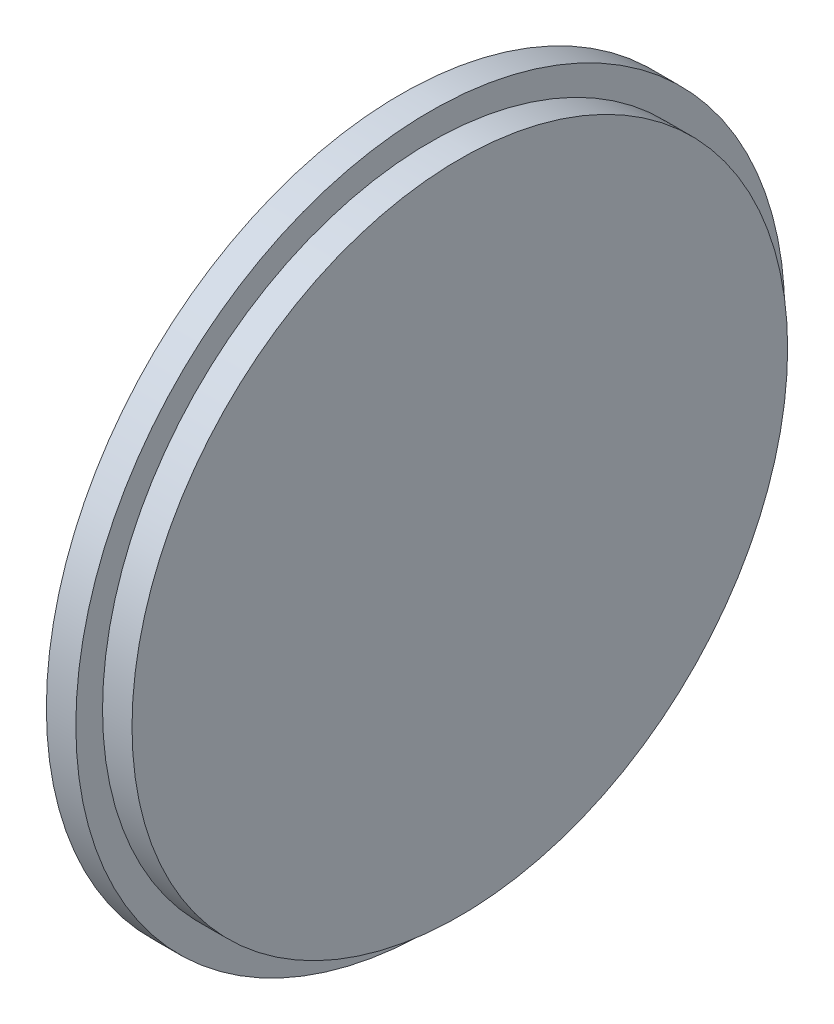
ISO-10303-21;
HEADER;
FILE_DESCRIPTION(('STEP AP214'),'2;1');
FILE_NAME('part.step','',(''),(''),'','','');
FILE_SCHEMA(('AUTOMOTIVE_DESIGN { 1 0 10303 214 1 1 1 1 }'));
ENDSEC;
DATA;
#1=APPLICATION_CONTEXT('core data for automotive mechanical design processes');
#2=APPLICATION_PROTOCOL_DEFINITION('international standard','automotive_design',2000,#1);
#3=PRODUCT_CONTEXT('',#1,'mechanical');
#4=PRODUCT('Part','Part','',(#3));
#5=PRODUCT_RELATED_PRODUCT_CATEGORY('part','',(#4));
#6=PRODUCT_DEFINITION_FORMATION('','',#4);
#7=PRODUCT_DEFINITION_CONTEXT('part definition',#1,'design');
#8=PRODUCT_DEFINITION('design','',#6,#7);
#9=PRODUCT_DEFINITION_SHAPE('','',#8);
#10=(LENGTH_UNIT() NAMED_UNIT(*) SI_UNIT(.MILLI.,.METRE.));
#11=(NAMED_UNIT(*) PLANE_ANGLE_UNIT() SI_UNIT($,.RADIAN.));
#12=(NAMED_UNIT(*) SI_UNIT($,.STERADIAN.) SOLID_ANGLE_UNIT());
#13=UNCERTAINTY_MEASURE_WITH_UNIT(LENGTH_MEASURE(1.E-05),#10,'distance_accuracy_value','');
#14=(GEOMETRIC_REPRESENTATION_CONTEXT(3) GLOBAL_UNCERTAINTY_ASSIGNED_CONTEXT((#13)) GLOBAL_UNIT_ASSIGNED_CONTEXT((#10,
#11,#12)) REPRESENTATION_CONTEXT('',''));
#15=CARTESIAN_POINT('',(0.,0.,0.));
#16=DIRECTION('',(0.,0.,1.));
#17=DIRECTION('',(1.,0.,0.));
#18=AXIS2_PLACEMENT_3D('',#15,#16,#17);
#19=CARTESIAN_POINT('',(27.9,0.,30.));
#20=DIRECTION('',(-1.,0.,0.));
#21=DIRECTION('',(0.,0.,1.));
#22=AXIS2_PLACEMENT_3D('',#19,#20,#21);
#23=CYLINDRICAL_SURFACE('',#22,19.25);
#24=CARTESIAN_POINT('',(27.9,0.,30.));
#25=DIRECTION('',(1.,0.,0.));
#26=DIRECTION('',(0.,0.,-1.));
#27=AXIS2_PLACEMENT_3D('',#24,#25,#26);
#28=CIRCLE('',#27,19.25);
#29=CARTESIAN_POINT('',(27.9,0.,10.75));
#30=VERTEX_POINT('',#29);
#31=EDGE_CURVE('E42',#30,#30,#28,.T.);
#32=ORIENTED_EDGE('',*,*,#31,.F.);
#33=EDGE_LOOP('',(#32));
#34=FACE_BOUND('',#33,.T.);
#35=CARTESIAN_POINT('',(26.3,0.,30.));
#36=DIRECTION('',(1.,0.,0.));
#37=DIRECTION('',(0.,0.,-1.));
#38=AXIS2_PLACEMENT_3D('',#35,#36,#37);
#39=CIRCLE('',#38,19.25);
#40=CARTESIAN_POINT('',(26.3,0.,10.75));
#41=VERTEX_POINT('',#40);
#42=EDGE_CURVE('E37',#41,#41,#39,.T.);
#43=ORIENTED_EDGE('',*,*,#42,.T.);
#44=EDGE_LOOP('',(#43));
#45=FACE_BOUND('',#44,.T.);
#46=ADVANCED_FACE('F40',(#34,#45),#23,.T.);
#47=CARTESIAN_POINT('',(27.9,0.,30.));
#48=DIRECTION('',(1.,0.,0.));
#49=DIRECTION('',(0.,0.,-1.));
#50=AXIS2_PLACEMENT_3D('',#47,#48,#49);
#51=PLANE('',#50);
#52=CARTESIAN_POINT('',(27.9,0.,30.));
#53=DIRECTION('',(1.,0.,0.));
#54=DIRECTION('',(0.,0.,-1.));
#55=AXIS2_PLACEMENT_3D('',#52,#53,#54);
#56=CIRCLE('',#55,17.8);
#57=CARTESIAN_POINT('',(27.9,0.,12.2));
#58=VERTEX_POINT('',#57);
#59=EDGE_CURVE('E10',#58,#58,#56,.T.);
#60=ORIENTED_EDGE('',*,*,#59,.F.);
#61=EDGE_LOOP('',(#60));
#62=FACE_BOUND('',#61,.T.);
#63=ORIENTED_EDGE('',*,*,#31,.T.);
#64=EDGE_LOOP('',(#63));
#65=FACE_BOUND('',#64,.T.);
#66=ADVANCED_FACE('F62',(#62,#65),#51,.T.);
#67=CARTESIAN_POINT('',(26.3,0.,30.));
#68=DIRECTION('',(1.,0.,0.));
#69=DIRECTION('',(0.,0.,-1.));
#70=AXIS2_PLACEMENT_3D('',#67,#68,#69);
#71=PLANE('',#70);
#72=ORIENTED_EDGE('',*,*,#42,.F.);
#73=EDGE_LOOP('',(#72));
#74=FACE_BOUND('',#73,.T.);
#75=ADVANCED_FACE('F59',(#74),#71,.F.);
#76=CARTESIAN_POINT('',(29.5,0.,30.));
#77=DIRECTION('',(-1.,0.,0.));
#78=DIRECTION('',(0.,0.,1.));
#79=AXIS2_PLACEMENT_3D('',#76,#77,#78);
#80=CYLINDRICAL_SURFACE('',#79,17.8);
#81=CARTESIAN_POINT('',(29.5,0.,30.));
#82=DIRECTION('',(1.,0.,0.));
#83=DIRECTION('',(0.,0.,-1.));
#84=AXIS2_PLACEMENT_3D('',#81,#82,#83);
#85=CIRCLE('',#84,17.8);
#86=CARTESIAN_POINT('',(29.5,0.,12.2));
#87=VERTEX_POINT('',#86);
#88=EDGE_CURVE('E49',#87,#87,#85,.T.);
#89=ORIENTED_EDGE('',*,*,#88,.F.);
#90=EDGE_LOOP('',(#89));
#91=FACE_BOUND('',#90,.T.);
#92=ORIENTED_EDGE('',*,*,#59,.T.);
#93=EDGE_LOOP('',(#92));
#94=FACE_BOUND('',#93,.T.);
#95=ADVANCED_FACE('F58',(#91,#94),#80,.T.);
#96=CARTESIAN_POINT('',(29.5,0.,30.));
#97=DIRECTION('',(1.,0.,0.));
#98=DIRECTION('',(0.,0.,-1.));
#99=AXIS2_PLACEMENT_3D('',#96,#97,#98);
#100=PLANE('',#99);
#101=ORIENTED_EDGE('',*,*,#88,.T.);
#102=EDGE_LOOP('',(#101));
#103=FACE_BOUND('',#102,.T.);
#104=ADVANCED_FACE('F70',(#103),#100,.T.);
#105=CLOSED_SHELL('',(#46,#66,#75,#95,#104));
#106=MANIFOLD_SOLID_BREP('B2',#105);
#107=ADVANCED_BREP_SHAPE_REPRESENTATION('',(#18,#106),#14);
#108=SHAPE_DEFINITION_REPRESENTATION(#9,#107);
ENDSEC;
END-ISO-10303-21;
